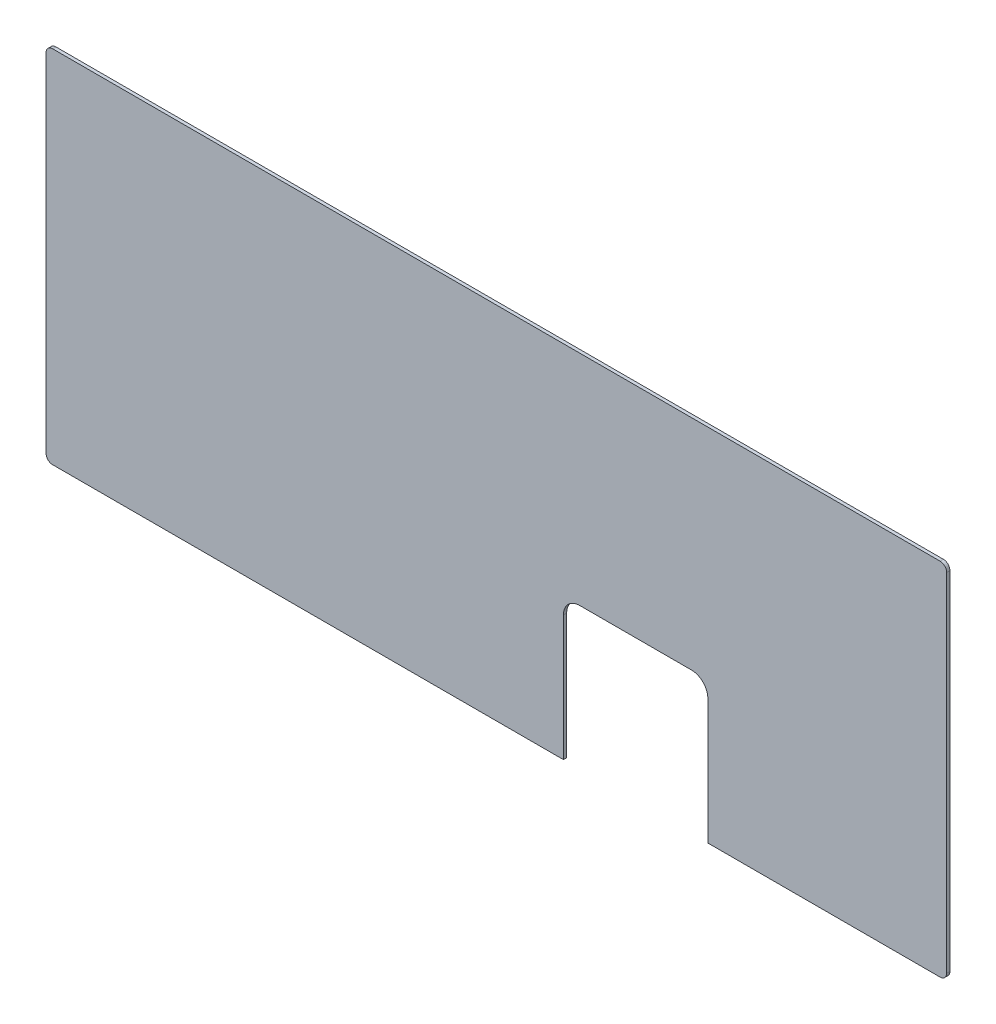
ISO-10303-21;
HEADER;
FILE_DESCRIPTION(('STEP AP214'),'2;1');
FILE_NAME('part.step','',(''),(''),'','','');
FILE_SCHEMA(('AUTOMOTIVE_DESIGN { 1 0 10303 214 1 1 1 1 }'));
ENDSEC;
DATA;
#1=APPLICATION_CONTEXT('core data for automotive mechanical design processes');
#2=APPLICATION_PROTOCOL_DEFINITION('international standard','automotive_design',2000,#1);
#3=PRODUCT_CONTEXT('',#1,'mechanical');
#4=PRODUCT('Part','Part','',(#3));
#5=PRODUCT_RELATED_PRODUCT_CATEGORY('part','',(#4));
#6=PRODUCT_DEFINITION_FORMATION('','',#4);
#7=PRODUCT_DEFINITION_CONTEXT('part definition',#1,'design');
#8=PRODUCT_DEFINITION('design','',#6,#7);
#9=PRODUCT_DEFINITION_SHAPE('','',#8);
#10=(LENGTH_UNIT() NAMED_UNIT(*) SI_UNIT(.MILLI.,.METRE.));
#11=(NAMED_UNIT(*) PLANE_ANGLE_UNIT() SI_UNIT($,.RADIAN.));
#12=(NAMED_UNIT(*) SI_UNIT($,.STERADIAN.) SOLID_ANGLE_UNIT());
#13=UNCERTAINTY_MEASURE_WITH_UNIT(LENGTH_MEASURE(1.E-05),#10,'distance_accuracy_value','');
#14=(GEOMETRIC_REPRESENTATION_CONTEXT(3) GLOBAL_UNCERTAINTY_ASSIGNED_CONTEXT((#13)) GLOBAL_UNIT_ASSIGNED_CONTEXT((#10,
#11,#12)) REPRESENTATION_CONTEXT('',''));
#15=CARTESIAN_POINT('',(0.,0.,0.));
#16=DIRECTION('',(0.,0.,1.));
#17=DIRECTION('',(1.,0.,0.));
#18=AXIS2_PLACEMENT_3D('',#15,#16,#17);
#19=CARTESIAN_POINT('',(-66.75,-64.7739520958084,-1.));
#20=DIRECTION('',(0.,0.,1.));
#21=DIRECTION('',(1.,0.,0.));
#22=AXIS2_PLACEMENT_3D('',#19,#20,#21);
#23=CYLINDRICAL_SURFACE('',#22,2.);
#24=CARTESIAN_POINT('',(-66.75,-64.7739520958084,0.));
#25=DIRECTION('',(0.,0.,1.));
#26=DIRECTION('',(-1.,0.,0.));
#27=AXIS2_PLACEMENT_3D('',#24,#25,#26);
#28=CIRCLE('',#27,2.);
#29=CARTESIAN_POINT('',(-68.75,-64.7739520958084,0.));
#30=VERTEX_POINT('',#29);
#31=CARTESIAN_POINT('',(-66.75,-66.7739520958084,0.));
#32=VERTEX_POINT('',#31);
#33=EDGE_CURVE('E169',#30,#32,#28,.T.);
#34=ORIENTED_EDGE('',*,*,#33,.F.);
#35=DIRECTION('',(0.,0.,1.));
#36=VECTOR('',#35,1.);
#37=CARTESIAN_POINT('',(-68.75,-64.7739520958084,-1.));
#38=LINE('',#37,#36);
#39=CARTESIAN_POINT('',(-68.75,-64.7739520958084,-1.));
#40=VERTEX_POINT('',#39);
#41=EDGE_CURVE('E11',#40,#30,#38,.T.);
#42=ORIENTED_EDGE('',*,*,#41,.F.);
#43=CARTESIAN_POINT('',(-66.75,-64.7739520958084,-1.));
#44=DIRECTION('',(0.,0.,1.));
#45=DIRECTION('',(-1.,0.,0.));
#46=AXIS2_PLACEMENT_3D('',#43,#44,#45);
#47=CIRCLE('',#46,2.);
#48=CARTESIAN_POINT('',(-66.75,-66.7739520958084,-1.));
#49=VERTEX_POINT('',#48);
#50=EDGE_CURVE('E207',#40,#49,#47,.T.);
#51=ORIENTED_EDGE('',*,*,#50,.T.);
#52=DIRECTION('',(0.,0.,1.));
#53=VECTOR('',#52,1.);
#54=CARTESIAN_POINT('',(-66.75,-66.7739520958084,-1.));
#55=LINE('',#54,#53);
#56=EDGE_CURVE('E39',#49,#32,#55,.T.);
#57=ORIENTED_EDGE('',*,*,#56,.T.);
#58=EDGE_LOOP('',(#34,#42,#51,#57));
#59=FACE_BOUND('',#58,.T.);
#60=ADVANCED_FACE('F36',(#59),#23,.T.);
#61=CARTESIAN_POINT('',(-68.75,-64.7739520958084,-1.));
#62=DIRECTION('',(-1.,0.,0.));
#63=DIRECTION('',(0.,0.,1.));
#64=AXIS2_PLACEMENT_3D('',#61,#62,#63);
#65=PLANE('',#64);
#66=DIRECTION('',(0.,-1.,0.));
#67=VECTOR('',#66,1.);
#68=CARTESIAN_POINT('',(-68.75,-64.7739520958084,0.));
#69=LINE('',#68,#67);
#70=CARTESIAN_POINT('',(-68.75,41.2260479041916,0.));
#71=VERTEX_POINT('',#70);
#72=EDGE_CURVE('E205',#71,#30,#69,.T.);
#73=ORIENTED_EDGE('',*,*,#72,.F.);
#74=DIRECTION('',(0.,0.,1.));
#75=VECTOR('',#74,1.);
#76=CARTESIAN_POINT('',(-68.75,41.2260479041916,-1.));
#77=LINE('',#76,#75);
#78=CARTESIAN_POINT('',(-68.75,41.2260479041916,-1.));
#79=VERTEX_POINT('',#78);
#80=EDGE_CURVE('E45',#79,#71,#77,.T.);
#81=ORIENTED_EDGE('',*,*,#80,.F.);
#82=DIRECTION('',(0.,-1.,0.));
#83=VECTOR('',#82,1.);
#84=CARTESIAN_POINT('',(-68.75,-64.7739520958084,-1.));
#85=LINE('',#84,#83);
#86=EDGE_CURVE('E159',#79,#40,#85,.T.);
#87=ORIENTED_EDGE('',*,*,#86,.T.);
#88=ORIENTED_EDGE('',*,*,#41,.T.);
#89=EDGE_LOOP('',(#73,#81,#87,#88));
#90=FACE_BOUND('',#89,.T.);
#91=ADVANCED_FACE('F231',(#90),#65,.T.);
#92=CARTESIAN_POINT('',(-66.75,41.2260479041916,-1.));
#93=DIRECTION('',(0.,0.,1.));
#94=DIRECTION('',(1.,0.,0.));
#95=AXIS2_PLACEMENT_3D('',#92,#93,#94);
#96=CYLINDRICAL_SURFACE('',#95,2.);
#97=CARTESIAN_POINT('',(-66.75,41.2260479041916,0.));
#98=DIRECTION('',(0.,0.,1.));
#99=DIRECTION('',(1.,0.,0.));
#100=AXIS2_PLACEMENT_3D('',#97,#98,#99);
#101=CIRCLE('',#100,2.);
#102=CARTESIAN_POINT('',(-66.75,43.2260479041916,0.));
#103=VERTEX_POINT('',#102);
#104=EDGE_CURVE('E146',#103,#71,#101,.T.);
#105=ORIENTED_EDGE('',*,*,#104,.F.);
#106=DIRECTION('',(0.,0.,1.));
#107=VECTOR('',#106,1.);
#108=CARTESIAN_POINT('',(-66.75,43.2260479041916,-1.));
#109=LINE('',#108,#107);
#110=CARTESIAN_POINT('',(-66.75,43.2260479041916,-1.));
#111=VERTEX_POINT('',#110);
#112=EDGE_CURVE('E141',#111,#103,#109,.T.);
#113=ORIENTED_EDGE('',*,*,#112,.F.);
#114=CARTESIAN_POINT('',(-66.75,41.2260479041916,-1.));
#115=DIRECTION('',(0.,0.,1.));
#116=DIRECTION('',(1.,0.,0.));
#117=AXIS2_PLACEMENT_3D('',#114,#115,#116);
#118=CIRCLE('',#117,2.);
#119=EDGE_CURVE('E144',#111,#79,#118,.T.);
#120=ORIENTED_EDGE('',*,*,#119,.T.);
#121=ORIENTED_EDGE('',*,*,#80,.T.);
#122=EDGE_LOOP('',(#105,#113,#120,#121));
#123=FACE_BOUND('',#122,.T.);
#124=ADVANCED_FACE('F143',(#123),#96,.T.);
#125=CARTESIAN_POINT('',(-66.75,43.2260479041916,-1.));
#126=DIRECTION('',(0.,1.,0.));
#127=DIRECTION('',(0.,0.,1.));
#128=AXIS2_PLACEMENT_3D('',#125,#126,#127);
#129=PLANE('',#128);
#130=DIRECTION('',(-1.,0.,0.));
#131=VECTOR('',#130,1.);
#132=CARTESIAN_POINT('',(-66.75,43.2260479041916,0.));
#133=LINE('',#132,#131);
#134=CARTESIAN_POINT('',(204.25,43.2260479041916,0.));
#135=VERTEX_POINT('',#134);
#136=EDGE_CURVE('E202',#135,#103,#133,.T.);
#137=ORIENTED_EDGE('',*,*,#136,.F.);
#138=DIRECTION('',(0.,0.,1.));
#139=VECTOR('',#138,1.);
#140=CARTESIAN_POINT('',(204.25,43.2260479041916,-1.));
#141=LINE('',#140,#139);
#142=CARTESIAN_POINT('',(204.25,43.2260479041916,-1.));
#143=VERTEX_POINT('',#142);
#144=EDGE_CURVE('E151',#143,#135,#141,.T.);
#145=ORIENTED_EDGE('',*,*,#144,.F.);
#146=DIRECTION('',(-1.,0.,0.));
#147=VECTOR('',#146,1.);
#148=CARTESIAN_POINT('',(-66.75,43.2260479041916,-1.));
#149=LINE('',#148,#147);
#150=EDGE_CURVE('E157',#143,#111,#149,.T.);
#151=ORIENTED_EDGE('',*,*,#150,.T.);
#152=ORIENTED_EDGE('',*,*,#112,.T.);
#153=EDGE_LOOP('',(#137,#145,#151,#152));
#154=FACE_BOUND('',#153,.T.);
#155=ADVANCED_FACE('F161',(#154),#129,.T.);
#156=CARTESIAN_POINT('',(204.25,41.2260479041916,-1.));
#157=DIRECTION('',(0.,0.,1.));
#158=DIRECTION('',(1.,0.,0.));
#159=AXIS2_PLACEMENT_3D('',#156,#157,#158);
#160=CYLINDRICAL_SURFACE('',#159,2.);
#161=CARTESIAN_POINT('',(204.25,41.2260479041916,0.));
#162=DIRECTION('',(0.,0.,1.));
#163=DIRECTION('',(1.,0.,0.));
#164=AXIS2_PLACEMENT_3D('',#161,#162,#163);
#165=CIRCLE('',#164,2.);
#166=CARTESIAN_POINT('',(206.25,41.2260479041916,0.));
#167=VERTEX_POINT('',#166);
#168=EDGE_CURVE('E199',#167,#135,#165,.T.);
#169=ORIENTED_EDGE('',*,*,#168,.F.);
#170=DIRECTION('',(0.,0.,1.));
#171=VECTOR('',#170,1.);
#172=CARTESIAN_POINT('',(206.25,41.2260479041916,-1.));
#173=LINE('',#172,#171);
#174=CARTESIAN_POINT('',(206.25,41.2260479041916,-1.));
#175=VERTEX_POINT('',#174);
#176=EDGE_CURVE('E211',#175,#167,#173,.T.);
#177=ORIENTED_EDGE('',*,*,#176,.F.);
#178=CARTESIAN_POINT('',(204.25,41.2260479041916,-1.));
#179=DIRECTION('',(0.,0.,1.));
#180=DIRECTION('',(1.,0.,0.));
#181=AXIS2_PLACEMENT_3D('',#178,#179,#180);
#182=CIRCLE('',#181,2.);
#183=EDGE_CURVE('E162',#175,#143,#182,.T.);
#184=ORIENTED_EDGE('',*,*,#183,.T.);
#185=ORIENTED_EDGE('',*,*,#144,.T.);
#186=EDGE_LOOP('',(#169,#177,#184,#185));
#187=FACE_BOUND('',#186,.T.);
#188=ADVANCED_FACE('F244',(#187),#160,.T.);
#189=CARTESIAN_POINT('',(206.25,-64.7739520958084,-1.));
#190=DIRECTION('',(1.,0.,0.));
#191=DIRECTION('',(0.,0.,-1.));
#192=AXIS2_PLACEMENT_3D('',#189,#190,#191);
#193=PLANE('',#192);
#194=DIRECTION('',(0.,1.,0.));
#195=VECTOR('',#194,1.);
#196=CARTESIAN_POINT('',(206.25,-64.7739520958084,0.));
#197=LINE('',#196,#195);
#198=CARTESIAN_POINT('',(206.25,-64.7739520958084,0.));
#199=VERTEX_POINT('',#198);
#200=EDGE_CURVE('E196',#199,#167,#197,.T.);
#201=ORIENTED_EDGE('',*,*,#200,.F.);
#202=DIRECTION('',(0.,0.,1.));
#203=VECTOR('',#202,1.);
#204=CARTESIAN_POINT('',(206.25,-64.7739520958084,-1.));
#205=LINE('',#204,#203);
#206=CARTESIAN_POINT('',(206.25,-64.7739520958084,-1.));
#207=VERTEX_POINT('',#206);
#208=EDGE_CURVE('E213',#207,#199,#205,.T.);
#209=ORIENTED_EDGE('',*,*,#208,.F.);
#210=DIRECTION('',(0.,1.,0.));
#211=VECTOR('',#210,1.);
#212=CARTESIAN_POINT('',(206.25,-64.7739520958084,-1.));
#213=LINE('',#212,#211);
#214=EDGE_CURVE('E164',#207,#175,#213,.T.);
#215=ORIENTED_EDGE('',*,*,#214,.T.);
#216=ORIENTED_EDGE('',*,*,#176,.T.);
#217=EDGE_LOOP('',(#201,#209,#215,#216));
#218=FACE_BOUND('',#217,.T.);
#219=ADVANCED_FACE('F247',(#218),#193,.T.);
#220=CARTESIAN_POINT('',(204.25,-64.7739520958084,-1.));
#221=DIRECTION('',(0.,0.,1.));
#222=DIRECTION('',(1.,0.,0.));
#223=AXIS2_PLACEMENT_3D('',#220,#221,#222);
#224=CYLINDRICAL_SURFACE('',#223,2.);
#225=CARTESIAN_POINT('',(204.25,-64.7739520958084,0.));
#226=DIRECTION('',(0.,0.,1.));
#227=DIRECTION('',(-1.,0.,0.));
#228=AXIS2_PLACEMENT_3D('',#225,#226,#227);
#229=CIRCLE('',#228,2.);
#230=CARTESIAN_POINT('',(204.25,-66.7739520958084,0.));
#231=VERTEX_POINT('',#230);
#232=EDGE_CURVE('E193',#231,#199,#229,.T.);
#233=ORIENTED_EDGE('',*,*,#232,.F.);
#234=DIRECTION('',(0.,0.,1.));
#235=VECTOR('',#234,1.);
#236=CARTESIAN_POINT('',(204.25,-66.7739520958084,-1.));
#237=LINE('',#236,#235);
#238=CARTESIAN_POINT('',(204.25,-66.7739520958084,-1.));
#239=VERTEX_POINT('',#238);
#240=EDGE_CURVE('E215',#239,#231,#237,.T.);
#241=ORIENTED_EDGE('',*,*,#240,.F.);
#242=CARTESIAN_POINT('',(204.25,-64.7739520958084,-1.));
#243=DIRECTION('',(0.,0.,1.));
#244=DIRECTION('',(-1.,0.,0.));
#245=AXIS2_PLACEMENT_3D('',#242,#243,#244);
#246=CIRCLE('',#245,2.);
#247=EDGE_CURVE('E436',#239,#207,#246,.T.);
#248=ORIENTED_EDGE('',*,*,#247,.T.);
#249=ORIENTED_EDGE('',*,*,#208,.T.);
#250=EDGE_LOOP('',(#233,#241,#248,#249));
#251=FACE_BOUND('',#250,.T.);
#252=ADVANCED_FACE('F251',(#251),#224,.T.);
#253=CARTESIAN_POINT('',(133.329321471336,-66.7739520958084,-1.));
#254=DIRECTION('',(0.,-1.,0.));
#255=DIRECTION('',(0.,0.,-1.));
#256=AXIS2_PLACEMENT_3D('',#253,#254,#255);
#257=PLANE('',#256);
#258=DIRECTION('',(1.,0.,0.));
#259=VECTOR('',#258,1.);
#260=CARTESIAN_POINT('',(133.329321471336,-66.7739520958084,0.));
#261=LINE('',#260,#259);
#262=CARTESIAN_POINT('',(133.329321471336,-66.7739520958084,0.));
#263=VERTEX_POINT('',#262);
#264=EDGE_CURVE('E190',#263,#231,#261,.T.);
#265=ORIENTED_EDGE('',*,*,#264,.F.);
#266=DIRECTION('',(0.,0.,1.));
#267=VECTOR('',#266,1.);
#268=CARTESIAN_POINT('',(133.329321471336,-66.7739520958084,-1.));
#269=LINE('',#268,#267);
#270=CARTESIAN_POINT('',(133.329321471336,-66.7739520958084,-1.));
#271=VERTEX_POINT('',#270);
#272=EDGE_CURVE('E217',#271,#263,#269,.T.);
#273=ORIENTED_EDGE('',*,*,#272,.F.);
#274=DIRECTION('',(1.,0.,0.));
#275=VECTOR('',#274,1.);
#276=CARTESIAN_POINT('',(133.329321471336,-66.7739520958084,-1.));
#277=LINE('',#276,#275);
#278=EDGE_CURVE('E429',#271,#239,#277,.T.);
#279=ORIENTED_EDGE('',*,*,#278,.T.);
#280=ORIENTED_EDGE('',*,*,#240,.T.);
#281=EDGE_LOOP('',(#265,#273,#279,#280));
#282=FACE_BOUND('',#281,.T.);
#283=ADVANCED_FACE('F255',(#282),#257,.T.);
#284=CARTESIAN_POINT('',(133.329321471336,-28.5207423938292,-1.));
#285=DIRECTION('',(-1.,0.,0.));
#286=DIRECTION('',(0.,0.,1.));
#287=AXIS2_PLACEMENT_3D('',#284,#285,#286);
#288=PLANE('',#287);
#289=DIRECTION('',(0.,-1.,0.));
#290=VECTOR('',#289,1.);
#291=CARTESIAN_POINT('',(133.329321471336,-28.5207423938292,0.));
#292=LINE('',#291,#290);
#293=CARTESIAN_POINT('',(133.329321471336,-28.5207423938292,0.));
#294=VERTEX_POINT('',#293);
#295=EDGE_CURVE('E187',#294,#263,#292,.T.);
#296=ORIENTED_EDGE('',*,*,#295,.F.);
#297=DIRECTION('',(0.,0.,1.));
#298=VECTOR('',#297,1.);
#299=CARTESIAN_POINT('',(133.329321471336,-28.5207423938292,-1.));
#300=LINE('',#299,#298);
#301=CARTESIAN_POINT('',(133.329321471336,-28.5207423938292,-1.));
#302=VERTEX_POINT('',#301);
#303=EDGE_CURVE('E219',#302,#294,#300,.T.);
#304=ORIENTED_EDGE('',*,*,#303,.F.);
#305=DIRECTION('',(0.,-1.,0.));
#306=VECTOR('',#305,1.);
#307=CARTESIAN_POINT('',(133.329321471336,-28.5207423938292,-1.));
#308=LINE('',#307,#306);
#309=EDGE_CURVE('E425',#302,#271,#308,.T.);
#310=ORIENTED_EDGE('',*,*,#309,.T.);
#311=ORIENTED_EDGE('',*,*,#272,.T.);
#312=EDGE_LOOP('',(#296,#304,#310,#311));
#313=FACE_BOUND('',#312,.T.);
#314=ADVANCED_FACE('F259',(#313),#288,.T.);
#315=CARTESIAN_POINT('',(128.329321471336,-28.5207423938291,-1.));
#316=DIRECTION('',(0.,0.,1.));
#317=DIRECTION('',(1.,0.,0.));
#318=AXIS2_PLACEMENT_3D('',#315,#316,#317);
#319=CYLINDRICAL_SURFACE('',#318,5.);
#320=CARTESIAN_POINT('',(128.329321471336,-28.5207423938291,0.));
#321=DIRECTION('',(0.,0.,-1.));
#322=DIRECTION('',(1.,0.,0.));
#323=AXIS2_PLACEMENT_3D('',#320,#321,#322);
#324=CIRCLE('',#323,5.);
#325=CARTESIAN_POINT('',(128.329321471336,-23.5207423938291,0.));
#326=VERTEX_POINT('',#325);
#327=EDGE_CURVE('E184',#326,#294,#324,.T.);
#328=ORIENTED_EDGE('',*,*,#327,.F.);
#329=DIRECTION('',(0.,0.,1.));
#330=VECTOR('',#329,1.);
#331=CARTESIAN_POINT('',(128.329321471336,-23.5207423938291,-1.));
#332=LINE('',#331,#330);
#333=CARTESIAN_POINT('',(128.329321471336,-23.5207423938291,-1.));
#334=VERTEX_POINT('',#333);
#335=EDGE_CURVE('E221',#334,#326,#332,.T.);
#336=ORIENTED_EDGE('',*,*,#335,.F.);
#337=CARTESIAN_POINT('',(128.329321471336,-28.5207423938291,-1.));
#338=DIRECTION('',(0.,0.,-1.));
#339=DIRECTION('',(1.,0.,0.));
#340=AXIS2_PLACEMENT_3D('',#337,#338,#339);
#341=CIRCLE('',#340,5.);
#342=EDGE_CURVE('E441',#334,#302,#341,.T.);
#343=ORIENTED_EDGE('',*,*,#342,.T.);
#344=ORIENTED_EDGE('',*,*,#303,.T.);
#345=EDGE_LOOP('',(#328,#336,#343,#344));
#346=FACE_BOUND('',#345,.T.);
#347=ADVANCED_FACE('F263',(#346),#319,.F.);
#348=CARTESIAN_POINT('',(94.2210002972665,-23.5207423938291,-1.));
#349=DIRECTION('',(0.,-1.,0.));
#350=DIRECTION('',(0.,0.,-1.));
#351=AXIS2_PLACEMENT_3D('',#348,#349,#350);
#352=PLANE('',#351);
#353=DIRECTION('',(1.,0.,0.));
#354=VECTOR('',#353,1.);
#355=CARTESIAN_POINT('',(94.2210002972665,-23.5207423938291,0.));
#356=LINE('',#355,#354);
#357=CARTESIAN_POINT('',(94.2210002972665,-23.5207423938291,0.));
#358=VERTEX_POINT('',#357);
#359=EDGE_CURVE('E181',#358,#326,#356,.T.);
#360=ORIENTED_EDGE('',*,*,#359,.F.);
#361=DIRECTION('',(0.,0.,1.));
#362=VECTOR('',#361,1.);
#363=CARTESIAN_POINT('',(94.2210002972665,-23.5207423938291,-1.));
#364=LINE('',#363,#362);
#365=CARTESIAN_POINT('',(94.2210002972665,-23.5207423938291,-1.));
#366=VERTEX_POINT('',#365);
#367=EDGE_CURVE('E223',#366,#358,#364,.T.);
#368=ORIENTED_EDGE('',*,*,#367,.F.);
#369=DIRECTION('',(1.,0.,0.));
#370=VECTOR('',#369,1.);
#371=CARTESIAN_POINT('',(94.2210002972665,-23.5207423938291,-1.));
#372=LINE('',#371,#370);
#373=EDGE_CURVE('E418',#366,#334,#372,.T.);
#374=ORIENTED_EDGE('',*,*,#373,.T.);
#375=ORIENTED_EDGE('',*,*,#335,.T.);
#376=EDGE_LOOP('',(#360,#368,#374,#375));
#377=FACE_BOUND('',#376,.T.);
#378=ADVANCED_FACE('F267',(#377),#352,.T.);
#379=CARTESIAN_POINT('',(94.2210002972665,-28.5207423938291,-1.));
#380=DIRECTION('',(0.,0.,1.));
#381=DIRECTION('',(1.,0.,0.));
#382=AXIS2_PLACEMENT_3D('',#379,#380,#381);
#383=CYLINDRICAL_SURFACE('',#382,5.);
#384=CARTESIAN_POINT('',(94.2210002972665,-28.5207423938291,0.));
#385=DIRECTION('',(0.,0.,-1.));
#386=DIRECTION('',(1.,0.,0.));
#387=AXIS2_PLACEMENT_3D('',#384,#385,#386);
#388=CIRCLE('',#387,5.);
#389=CARTESIAN_POINT('',(89.2210002972665,-28.5207423938292,0.));
#390=VERTEX_POINT('',#389);
#391=EDGE_CURVE('E178',#390,#358,#388,.T.);
#392=ORIENTED_EDGE('',*,*,#391,.F.);
#393=DIRECTION('',(0.,0.,1.));
#394=VECTOR('',#393,1.);
#395=CARTESIAN_POINT('',(89.2210002972665,-28.5207423938292,-1.));
#396=LINE('',#395,#394);
#397=CARTESIAN_POINT('',(89.2210002972665,-28.5207423938292,-1.));
#398=VERTEX_POINT('',#397);
#399=EDGE_CURVE('E225',#398,#390,#396,.T.);
#400=ORIENTED_EDGE('',*,*,#399,.F.);
#401=CARTESIAN_POINT('',(94.2210002972665,-28.5207423938291,-1.));
#402=DIRECTION('',(0.,0.,-1.));
#403=DIRECTION('',(1.,0.,0.));
#404=AXIS2_PLACEMENT_3D('',#401,#402,#403);
#405=CIRCLE('',#404,5.);
#406=EDGE_CURVE('E414',#398,#366,#405,.T.);
#407=ORIENTED_EDGE('',*,*,#406,.T.);
#408=ORIENTED_EDGE('',*,*,#367,.T.);
#409=EDGE_LOOP('',(#392,#400,#407,#408));
#410=FACE_BOUND('',#409,.T.);
#411=ADVANCED_FACE('F271',(#410),#383,.F.);
#412=CARTESIAN_POINT('',(89.2210002972665,-66.7739520958084,-1.));
#413=DIRECTION('',(1.,0.,0.));
#414=DIRECTION('',(0.,0.,-1.));
#415=AXIS2_PLACEMENT_3D('',#412,#413,#414);
#416=PLANE('',#415);
#417=DIRECTION('',(0.,1.,0.));
#418=VECTOR('',#417,1.);
#419=CARTESIAN_POINT('',(89.2210002972665,-66.7739520958084,0.));
#420=LINE('',#419,#418);
#421=CARTESIAN_POINT('',(89.2210002972665,-66.7739520958084,0.));
#422=VERTEX_POINT('',#421);
#423=EDGE_CURVE('E175',#422,#390,#420,.T.);
#424=ORIENTED_EDGE('',*,*,#423,.F.);
#425=DIRECTION('',(0.,0.,1.));
#426=VECTOR('',#425,1.);
#427=CARTESIAN_POINT('',(89.2210002972665,-66.7739520958084,-1.));
#428=LINE('',#427,#426);
#429=CARTESIAN_POINT('',(89.2210002972665,-66.7739520958084,-1.));
#430=VERTEX_POINT('',#429);
#431=EDGE_CURVE('E226',#430,#422,#428,.T.);
#432=ORIENTED_EDGE('',*,*,#431,.F.);
#433=DIRECTION('',(0.,1.,0.));
#434=VECTOR('',#433,1.);
#435=CARTESIAN_POINT('',(89.2210002972665,-66.7739520958084,-1.));
#436=LINE('',#435,#434);
#437=EDGE_CURVE('E445',#430,#398,#436,.T.);
#438=ORIENTED_EDGE('',*,*,#437,.T.);
#439=ORIENTED_EDGE('',*,*,#399,.T.);
#440=EDGE_LOOP('',(#424,#432,#438,#439));
#441=FACE_BOUND('',#440,.T.);
#442=ADVANCED_FACE('F275',(#441),#416,.T.);
#443=CARTESIAN_POINT('',(-66.75,-66.7739520958084,-1.));
#444=DIRECTION('',(0.,-1.,0.));
#445=DIRECTION('',(0.,0.,-1.));
#446=AXIS2_PLACEMENT_3D('',#443,#444,#445);
#447=PLANE('',#446);
#448=DIRECTION('',(1.,0.,0.));
#449=VECTOR('',#448,1.);
#450=CARTESIAN_POINT('',(-66.75,-66.7739520958084,0.));
#451=LINE('',#450,#449);
#452=EDGE_CURVE('E172',#32,#422,#451,.T.);
#453=ORIENTED_EDGE('',*,*,#452,.F.);
#454=ORIENTED_EDGE('',*,*,#56,.F.);
#455=DIRECTION('',(1.,0.,0.));
#456=VECTOR('',#455,1.);
#457=CARTESIAN_POINT('',(-66.75,-66.7739520958084,-1.));
#458=LINE('',#457,#456);
#459=EDGE_CURVE('E447',#49,#430,#458,.T.);
#460=ORIENTED_EDGE('',*,*,#459,.T.);
#461=ORIENTED_EDGE('',*,*,#431,.T.);
#462=EDGE_LOOP('',(#453,#454,#460,#461));
#463=FACE_BOUND('',#462,.T.);
#464=ADVANCED_FACE('F228',(#463),#447,.T.);
#465=CARTESIAN_POINT('',(-66.75,-64.7739520958084,-1.));
#466=DIRECTION('',(0.,0.,-1.));
#467=DIRECTION('',(-1.,0.,0.));
#468=AXIS2_PLACEMENT_3D('',#465,#466,#467);
#469=PLANE('',#468);
#470=ORIENTED_EDGE('',*,*,#50,.F.);
#471=ORIENTED_EDGE('',*,*,#86,.F.);
#472=ORIENTED_EDGE('',*,*,#119,.F.);
#473=ORIENTED_EDGE('',*,*,#150,.F.);
#474=ORIENTED_EDGE('',*,*,#183,.F.);
#475=ORIENTED_EDGE('',*,*,#214,.F.);
#476=ORIENTED_EDGE('',*,*,#247,.F.);
#477=ORIENTED_EDGE('',*,*,#278,.F.);
#478=ORIENTED_EDGE('',*,*,#309,.F.);
#479=ORIENTED_EDGE('',*,*,#342,.F.);
#480=ORIENTED_EDGE('',*,*,#373,.F.);
#481=ORIENTED_EDGE('',*,*,#406,.F.);
#482=ORIENTED_EDGE('',*,*,#437,.F.);
#483=ORIENTED_EDGE('',*,*,#459,.F.);
#484=EDGE_LOOP('',(#470,#471,#472,#473,#474,#475,#476,#477,#478,#479,#480,#481,#482,#483));
#485=FACE_BOUND('',#484,.T.);
#486=ADVANCED_FACE('F155',(#485),#469,.T.);
#487=CARTESIAN_POINT('',(-66.75,-64.7739520958084,0.));
#488=DIRECTION('',(0.,0.,-1.));
#489=DIRECTION('',(-1.,0.,0.));
#490=AXIS2_PLACEMENT_3D('',#487,#488,#489);
#491=PLANE('',#490);
#492=ORIENTED_EDGE('',*,*,#33,.T.);
#493=ORIENTED_EDGE('',*,*,#452,.T.);
#494=ORIENTED_EDGE('',*,*,#423,.T.);
#495=ORIENTED_EDGE('',*,*,#391,.T.);
#496=ORIENTED_EDGE('',*,*,#359,.T.);
#497=ORIENTED_EDGE('',*,*,#327,.T.);
#498=ORIENTED_EDGE('',*,*,#295,.T.);
#499=ORIENTED_EDGE('',*,*,#264,.T.);
#500=ORIENTED_EDGE('',*,*,#232,.T.);
#501=ORIENTED_EDGE('',*,*,#200,.T.);
#502=ORIENTED_EDGE('',*,*,#168,.T.);
#503=ORIENTED_EDGE('',*,*,#136,.T.);
#504=ORIENTED_EDGE('',*,*,#104,.T.);
#505=ORIENTED_EDGE('',*,*,#72,.T.);
#506=EDGE_LOOP('',(#492,#493,#494,#495,#496,#497,#498,#499,#500,#501,#502,#503,#504,#505));
#507=FACE_BOUND('',#506,.T.);
#508=ADVANCED_FACE('F230',(#507),#491,.F.);
#509=CLOSED_SHELL('',(#60,#91,#124,#155,#188,#219,#252,#283,#314,#347,#378,#411,#442,#464,#486,#508));
#510=MANIFOLD_SOLID_BREP('B2',#509);
#511=ADVANCED_BREP_SHAPE_REPRESENTATION('',(#18,#510),#14);
#512=SHAPE_DEFINITION_REPRESENTATION(#9,#511);
ENDSEC;
END-ISO-10303-21;
